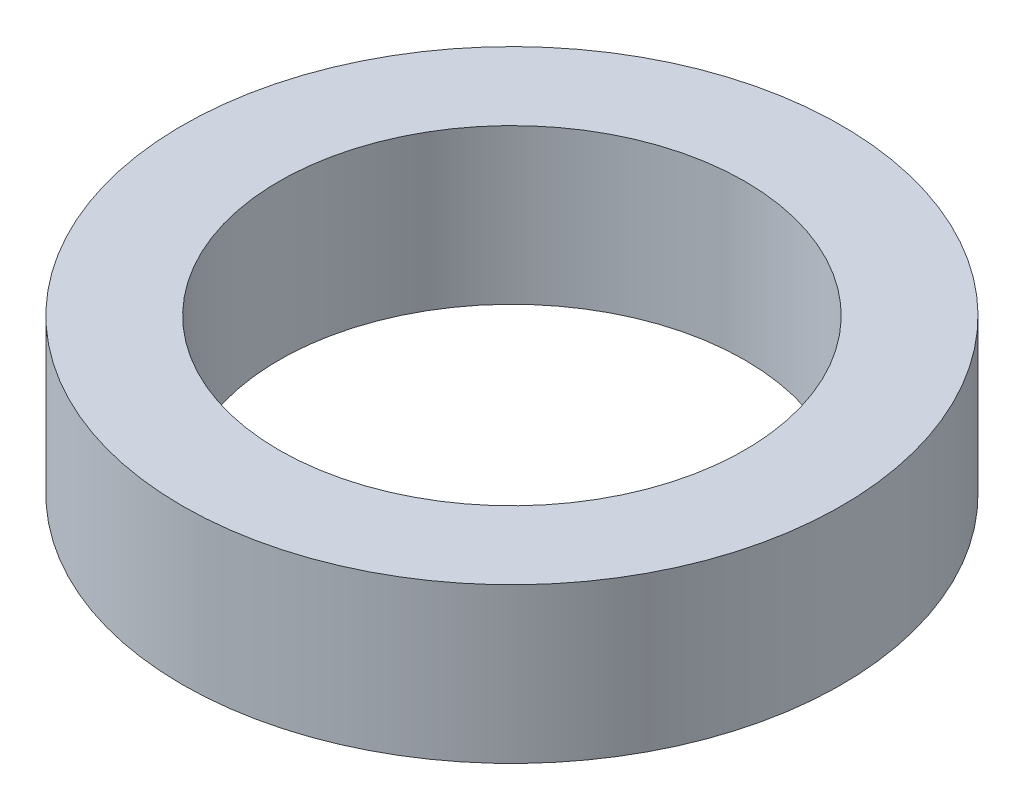
ISO-10303-21;
HEADER;
FILE_DESCRIPTION(('STEP AP214'),'2;1');
FILE_NAME('part.step','',(''),(''),'','','');
FILE_SCHEMA(('AUTOMOTIVE_DESIGN { 1 0 10303 214 1 1 1 1 }'));
ENDSEC;
DATA;
#1=APPLICATION_CONTEXT('core data for automotive mechanical design processes');
#2=APPLICATION_PROTOCOL_DEFINITION('international standard','automotive_design',2000,#1);
#3=PRODUCT_CONTEXT('',#1,'mechanical');
#4=PRODUCT('Part','Part','',(#3));
#5=PRODUCT_RELATED_PRODUCT_CATEGORY('part','',(#4));
#6=PRODUCT_DEFINITION_FORMATION('','',#4);
#7=PRODUCT_DEFINITION_CONTEXT('part definition',#1,'design');
#8=PRODUCT_DEFINITION('design','',#6,#7);
#9=PRODUCT_DEFINITION_SHAPE('','',#8);
#10=(LENGTH_UNIT() NAMED_UNIT(*) SI_UNIT(.MILLI.,.METRE.));
#11=(NAMED_UNIT(*) PLANE_ANGLE_UNIT() SI_UNIT($,.RADIAN.));
#12=(NAMED_UNIT(*) SI_UNIT($,.STERADIAN.) SOLID_ANGLE_UNIT());
#13=UNCERTAINTY_MEASURE_WITH_UNIT(LENGTH_MEASURE(1.E-05),#10,'distance_accuracy_value','');
#14=(GEOMETRIC_REPRESENTATION_CONTEXT(3) GLOBAL_UNCERTAINTY_ASSIGNED_CONTEXT((#13)) GLOBAL_UNIT_ASSIGNED_CONTEXT((#10,
#11,#12)) REPRESENTATION_CONTEXT('',''));
#15=CARTESIAN_POINT('',(0.,0.,0.));
#16=DIRECTION('',(0.,0.,1.));
#17=DIRECTION('',(1.,0.,0.));
#18=AXIS2_PLACEMENT_3D('',#15,#16,#17);
#19=CARTESIAN_POINT('',(0.,50.8,0.));
#20=DIRECTION('',(0.,1.,0.));
#21=DIRECTION('',(0.,0.,1.));
#22=AXIS2_PLACEMENT_3D('',#19,#20,#21);
#23=PLANE('',#22);
#24=CARTESIAN_POINT('',(0.,50.8,0.));
#25=DIRECTION('',(0.,1.,0.));
#26=DIRECTION('',(0.,0.,1.));
#27=AXIS2_PLACEMENT_3D('',#24,#25,#26);
#28=CIRCLE('',#27,108.1786);
#29=CARTESIAN_POINT('',(0.,50.8,108.1786));
#30=VERTEX_POINT('',#29);
#31=EDGE_CURVE('E10',#30,#30,#28,.T.);
#32=ORIENTED_EDGE('',*,*,#31,.T.);
#33=EDGE_LOOP('',(#32));
#34=FACE_BOUND('',#33,.T.);
#35=CARTESIAN_POINT('',(0.,50.8,0.));
#36=DIRECTION('',(0.,1.,0.));
#37=DIRECTION('',(0.,0.,1.));
#38=AXIS2_PLACEMENT_3D('',#35,#36,#37);
#39=CIRCLE('',#38,76.4286);
#40=CARTESIAN_POINT('',(0.,50.8,76.4286));
#41=VERTEX_POINT('',#40);
#42=EDGE_CURVE('E48',#41,#41,#39,.T.);
#43=ORIENTED_EDGE('',*,*,#42,.F.);
#44=EDGE_LOOP('',(#43));
#45=FACE_BOUND('',#44,.T.);
#46=ADVANCED_FACE('F37',(#34,#45),#23,.T.);
#47=CARTESIAN_POINT('',(0.,0.,0.));
#48=DIRECTION('',(0.,1.,0.));
#49=DIRECTION('',(0.,0.,1.));
#50=AXIS2_PLACEMENT_3D('',#47,#48,#49);
#51=PLANE('',#50);
#52=CARTESIAN_POINT('',(0.,0.,0.));
#53=DIRECTION('',(0.,1.,0.));
#54=DIRECTION('',(0.,0.,1.));
#55=AXIS2_PLACEMENT_3D('',#52,#53,#54);
#56=CIRCLE('',#55,108.1786);
#57=CARTESIAN_POINT('',(0.,0.,108.1786));
#58=VERTEX_POINT('',#57);
#59=EDGE_CURVE('E41',#58,#58,#56,.T.);
#60=ORIENTED_EDGE('',*,*,#59,.F.);
#61=EDGE_LOOP('',(#60));
#62=FACE_BOUND('',#61,.T.);
#63=CARTESIAN_POINT('',(0.,0.,0.));
#64=DIRECTION('',(0.,1.,0.));
#65=DIRECTION('',(0.,0.,1.));
#66=AXIS2_PLACEMENT_3D('',#63,#64,#65);
#67=CIRCLE('',#66,76.4286);
#68=CARTESIAN_POINT('',(0.,0.,76.4286));
#69=VERTEX_POINT('',#68);
#70=EDGE_CURVE('E50',#69,#69,#67,.T.);
#71=ORIENTED_EDGE('',*,*,#70,.T.);
#72=EDGE_LOOP('',(#71));
#73=FACE_BOUND('',#72,.T.);
#74=ADVANCED_FACE('F60',(#62,#73),#51,.F.);
#75=CARTESIAN_POINT('',(0.,50.8,0.));
#76=DIRECTION('',(0.,-1.,0.));
#77=DIRECTION('',(0.,0.,-1.));
#78=AXIS2_PLACEMENT_3D('',#75,#76,#77);
#79=CYLINDRICAL_SURFACE('',#78,108.1786);
#80=ORIENTED_EDGE('',*,*,#31,.F.);
#81=EDGE_LOOP('',(#80));
#82=FACE_BOUND('',#81,.T.);
#83=ORIENTED_EDGE('',*,*,#59,.T.);
#84=EDGE_LOOP('',(#83));
#85=FACE_BOUND('',#84,.T.);
#86=ADVANCED_FACE('F39',(#82,#85),#79,.T.);
#87=CARTESIAN_POINT('',(0.,50.8,0.));
#88=DIRECTION('',(0.,-1.,0.));
#89=DIRECTION('',(0.,0.,-1.));
#90=AXIS2_PLACEMENT_3D('',#87,#88,#89);
#91=CYLINDRICAL_SURFACE('',#90,76.4286);
#92=ORIENTED_EDGE('',*,*,#42,.T.);
#93=EDGE_LOOP('',(#92));
#94=FACE_BOUND('',#93,.T.);
#95=ORIENTED_EDGE('',*,*,#70,.F.);
#96=EDGE_LOOP('',(#95));
#97=FACE_BOUND('',#96,.T.);
#98=ADVANCED_FACE('F56',(#94,#97),#91,.F.);
#99=CLOSED_SHELL('',(#46,#74,#86,#98));
#100=MANIFOLD_SOLID_BREP('B2',#99);
#101=ADVANCED_BREP_SHAPE_REPRESENTATION('',(#18,#100),#14);
#102=SHAPE_DEFINITION_REPRESENTATION(#9,#101);
ENDSEC;
END-ISO-10303-21;
